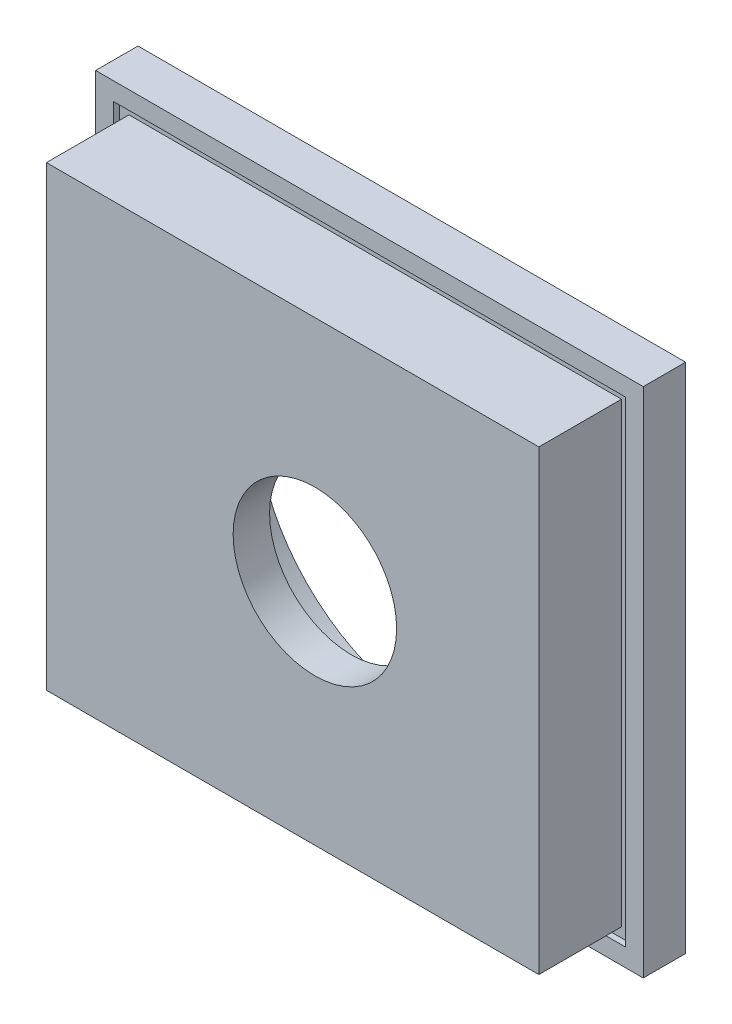
ISO-10303-21;
HEADER;
FILE_DESCRIPTION(('STEP AP214'),'2;1');
FILE_NAME('part.step','',(''),(''),'','','');
FILE_SCHEMA(('AUTOMOTIVE_DESIGN { 1 0 10303 214 1 1 1 1 }'));
ENDSEC;
DATA;
#1=APPLICATION_CONTEXT('core data for automotive mechanical design processes');
#2=APPLICATION_PROTOCOL_DEFINITION('international standard','automotive_design',2000,#1);
#3=PRODUCT_CONTEXT('',#1,'mechanical');
#4=PRODUCT('Part','Part','',(#3));
#5=PRODUCT_RELATED_PRODUCT_CATEGORY('part','',(#4));
#6=PRODUCT_DEFINITION_FORMATION('','',#4);
#7=PRODUCT_DEFINITION_CONTEXT('part definition',#1,'design');
#8=PRODUCT_DEFINITION('design','',#6,#7);
#9=PRODUCT_DEFINITION_SHAPE('','',#8);
#10=(LENGTH_UNIT() NAMED_UNIT(*) SI_UNIT(.MILLI.,.METRE.));
#11=(NAMED_UNIT(*) PLANE_ANGLE_UNIT() SI_UNIT($,.RADIAN.));
#12=(NAMED_UNIT(*) SI_UNIT($,.STERADIAN.) SOLID_ANGLE_UNIT());
#13=UNCERTAINTY_MEASURE_WITH_UNIT(LENGTH_MEASURE(1.E-05),#10,'distance_accuracy_value','');
#14=(GEOMETRIC_REPRESENTATION_CONTEXT(3) GLOBAL_UNCERTAINTY_ASSIGNED_CONTEXT((#13)) GLOBAL_UNIT_ASSIGNED_CONTEXT((#10,
#11,#12)) REPRESENTATION_CONTEXT('',''));
#15=CARTESIAN_POINT('',(0.,0.,0.));
#16=DIRECTION('',(0.,0.,1.));
#17=DIRECTION('',(1.,0.,0.));
#18=AXIS2_PLACEMENT_3D('',#15,#16,#17);
#19=CARTESIAN_POINT('',(150.3,130.,42.));
#20=DIRECTION('',(0.,0.,-1.));
#21=DIRECTION('',(-1.,0.,0.));
#22=AXIS2_PLACEMENT_3D('',#19,#20,#21);
#23=CYLINDRICAL_SURFACE('',#22,90.5);
#24=CARTESIAN_POINT('',(150.3,130.,0.));
#25=DIRECTION('',(0.,0.,1.));
#26=DIRECTION('',(1.,0.,0.));
#27=AXIS2_PLACEMENT_3D('',#24,#25,#26);
#28=CIRCLE('',#27,90.5);
#29=CARTESIAN_POINT('',(240.8,130.,0.));
#30=VERTEX_POINT('',#29);
#31=EDGE_CURVE('E275',#30,#30,#28,.T.);
#32=ORIENTED_EDGE('',*,*,#31,.F.);
#33=EDGE_LOOP('',(#32));
#34=FACE_BOUND('',#33,.T.);
#35=CARTESIAN_POINT('',(150.3,130.,42.));
#36=DIRECTION('',(0.,0.,1.));
#37=DIRECTION('',(1.,0.,0.));
#38=AXIS2_PLACEMENT_3D('',#35,#36,#37);
#39=CIRCLE('',#38,90.5);
#40=CARTESIAN_POINT('',(240.8,130.,42.));
#41=VERTEX_POINT('',#40);
#42=EDGE_CURVE('E271',#41,#41,#39,.T.);
#43=ORIENTED_EDGE('',*,*,#42,.T.);
#44=EDGE_LOOP('',(#43));
#45=FACE_BOUND('',#44,.T.);
#46=CARTESIAN_POINT('',(150.3,39.5,6.00000000000001));
#47=CARTESIAN_POINT('',(150.468461668725,39.5000006693389,6.00000745533471));
#48=CARTESIAN_POINT('',(150.63704430966,39.500475420697,6.01423729962665));
#49=CARTESIAN_POINT('',(150.969563332918,39.5023236582684,6.07080359932299));
#50=CARTESIAN_POINT('',(151.133493931284,39.503698216181,6.11317357142256));
#51=CARTESIAN_POINT('',(151.45184360416,39.5071904127946,6.22480957151065));
#52=CARTESIAN_POINT('',(151.606267312642,39.5093076860463,6.29406237371838));
#53=CARTESIAN_POINT('',(151.901254428058,39.5140465352439,6.45747905954885));
#54=CARTESIAN_POINT('',(152.04182119319,39.5166679885465,6.55163688702526));
#55=CARTESIAN_POINT('',(152.305221105626,39.5221215987173,6.76224808929431));
#56=CARTESIAN_POINT('',(152.428046288442,39.5249538493569,6.87871142316518));
#57=CARTESIAN_POINT('',(152.65240927785,39.5305090185251,7.13060969742526));
#58=CARTESIAN_POINT('',(152.753946233978,39.5332319326823,7.26604539539932));
#59=CARTESIAN_POINT('',(152.932865243994,39.5382618860058,7.55207638745825));
#60=CARTESIAN_POINT('',(153.010242173459,39.5405688369013,7.70267488867855));
#61=CARTESIAN_POINT('',(153.138611467042,39.544505788466,8.01473376018372));
#62=CARTESIAN_POINT('',(153.189603948693,39.5461357921509,8.17619408207942));
#63=CARTESIAN_POINT('',(153.263738797212,39.548534328688,8.50533001640761));
#64=CARTESIAN_POINT('',(153.286891473895,39.5493031804403,8.67300330428781));
#65=CARTESIAN_POINT('',(153.304721263274,39.5498936791272,9.00985822785477));
#66=CARTESIAN_POINT('',(153.299398503432,39.5497153303018,9.17903985678646));
#67=CARTESIAN_POINT('',(153.26043719998,39.5484318367469,9.51403906557217));
#68=CARTESIAN_POINT('',(153.226809797713,39.5473270566822,9.67985794278446));
#69=CARTESIAN_POINT('',(153.13221100757,39.5443158135154,10.0034956636558));
#70=CARTESIAN_POINT('',(153.071239552596,39.542409348446,10.1613144876831));
#71=CARTESIAN_POINT('',(152.92367063419,39.5380092236007,10.4645080649017));
#72=CARTESIAN_POINT('',(152.837068067339,39.5355154469051,10.6098803324154));
#73=CARTESIAN_POINT('',(152.640699033776,39.5302219378146,10.8840269513121));
#74=CARTESIAN_POINT('',(152.530932500387,39.5274222045389,11.0128012549155));
#75=CARTESIAN_POINT('',(152.291288400419,39.5218307656828,11.2501614086873));
#76=CARTESIAN_POINT('',(152.161401175114,39.519039064617,11.3587375075367));
#77=CARTESIAN_POINT('',(151.885236774167,39.5137796928698,11.5525440814761));
#78=CARTESIAN_POINT('',(151.738959595728,39.5113120222435,11.6377745525837));
#79=CARTESIAN_POINT('',(151.434162118433,39.5069788338669,11.7824694127845));
#80=CARTESIAN_POINT('',(151.275641671906,39.5051133233809,11.841933491041));
#81=CARTESIAN_POINT('',(150.950859939355,39.5021948558943,11.9334013484784));
#82=CARTESIAN_POINT('',(150.784598678986,39.501141896201,11.9654052186599));
#83=CARTESIAN_POINT('',(150.449139605765,39.4999675663169,12.001032226987));
#84=CARTESIAN_POINT('',(150.2799432273,39.4998457532538,12.0046688571849));
#85=CARTESIAN_POINT('',(149.943342384133,39.5005462740504,11.9834933207665));
#86=CARTESIAN_POINT('',(149.775937916878,39.5013686065642,11.9586811946998));
#87=CARTESIAN_POINT('',(149.447710550792,39.5038644623065,11.8813236392684));
#88=CARTESIAN_POINT('',(149.286886205605,39.5055377973808,11.8287843402005));
#89=CARTESIAN_POINT('',(148.976339885381,39.5095471193318,11.6974700602185));
#90=CARTESIAN_POINT('',(148.826617937851,39.5118831078503,11.618695014303));
#91=CARTESIAN_POINT('',(148.542464397464,39.5169557336091,11.4371106631431));
#92=CARTESIAN_POINT('',(148.408038607134,39.5196925219966,11.3342922820566));
#93=CARTESIAN_POINT('',(148.158351526558,39.5252578345468,11.1075532180054));
#94=CARTESIAN_POINT('',(148.043090294434,39.5280863589877,10.9836324710442));
#95=CARTESIAN_POINT('',(147.834959079449,39.5335175435777,10.7181484906926));
#96=CARTESIAN_POINT('',(147.742097805167,39.5361201156309,10.5765784280009));
#97=CARTESIAN_POINT('',(147.581462031146,39.540804575463,10.2798492708986));
#98=CARTESIAN_POINT('',(147.513687468302,39.5428864645515,10.124690210672));
#99=CARTESIAN_POINT('',(147.405164241662,39.5462941959245,9.80522017789087));
#100=CARTESIAN_POINT('',(147.3644099534,39.5476201955446,9.64091111769873));
#101=CARTESIAN_POINT('',(147.31106570951,39.5493670837606,9.30777817771377));
#102=CARTESIAN_POINT('',(147.298475712356,39.5497879736909,9.13895430457782));
#103=CARTESIAN_POINT('',(147.301818072997,39.5496771311941,8.80167108482766));
#104=CARTESIAN_POINT('',(147.317736704094,39.549145857227,8.63321160186203));
#105=CARTESIAN_POINT('',(147.377616193726,39.5471915412763,8.3013576877107));
#106=CARTESIAN_POINT('',(147.421577107632,39.5457684975319,8.13796326652712));
#107=CARTESIAN_POINT('',(147.536291156051,39.5421911362467,7.82087297961638));
#108=CARTESIAN_POINT('',(147.607044717949,39.5400368070407,7.66717726864473));
#109=CARTESIAN_POINT('',(147.773331556138,39.535239818264,7.37384855776983));
#110=CARTESIAN_POINT('',(147.868863953257,39.5325971760198,7.23421505917268));
#111=CARTESIAN_POINT('',(148.082039524629,39.5271201296457,6.97290983964526));
#112=CARTESIAN_POINT('',(148.199690970975,39.5242856540284,6.85124486908821));
#113=CARTESIAN_POINT('',(148.453783702316,39.5187444944926,6.62935939197558));
#114=CARTESIAN_POINT('',(148.590229628907,39.5160378423645,6.52914419844709));
#115=CARTESIAN_POINT('',(148.87809811239,39.5110563710085,6.35298232765119));
#116=CARTESIAN_POINT('',(149.029530884054,39.5087818494393,6.2770523540245));
#117=CARTESIAN_POINT('',(149.342886100432,39.5049261996033,6.15178313369161));
#118=CARTESIAN_POINT('',(149.504795792153,39.5033442458792,6.1024122156465));
#119=CARTESIAN_POINT('',(149.773105153564,39.5014742421491,6.04472973197653));
#120=CARTESIAN_POINT('',(149.877763714787,39.5009238039202,6.02797722653054));
#121=CARTESIAN_POINT('',(150.088265585228,39.5001864725459,6.0056100194304));
#122=CARTESIAN_POINT('',(150.194108894018,39.4999995792691,5.99999531374916));
#123=CARTESIAN_POINT('',(150.3,39.5,6.00000000000001));
#124=B_SPLINE_CURVE_WITH_KNOTS('',3,(#46,#47,#48,#49,#50,#51,#52,#53,#54,#55,#56,#57,#58,#59,
#60,#61,#62,#63,#64,#65,#66,#67,#68,#69,#70,#71,#72,#73,#74,#75,#76,#77,#78,#79,#80,#81,#82,#83,
#84,#85,#86,#87,#88,#89,#90,#91,#92,#93,#94,#95,#96,#97,#98,#99,#100,#101,#102,#103,#104,#105,
#106,#107,#108,#109,#110,#111,#112,#113,#114,#115,#116,#117,#118,#119,#120,#121,#122,#123),
.UNSPECIFIED.,.T.,.F.,(4,2,2,2,2,2,2,2,2,2,2,2,2,2,2,2,2,2,2,2,2,2,2,2,2,2,2,2,2,2,2,2,2,2,2,2,
2,2,4),(0.,0.504998486708911,1.01059954024219,1.51595216342126,2.02118201297409,
2.52663796827291,3.03211411267343,3.53769739753527,4.04327843018438,4.54867217511341,
5.05406365778116,5.55925629996511,6.0644501818013,6.56974472072814,7.07504071418544,
7.58058002565672,8.08611942336594,8.59166491955444,9.09720874040457,9.60251209937507,
10.1078147381083,10.6130057045029,11.1181979225612,11.6235811485378,12.1289659072038,
12.6345468321222,13.140126485252,13.6456008652554,14.1510745000037,14.656304818299,
15.1615361342244,15.6667755097343,16.1719969614228,16.6774077333081,17.1829435489884,
17.6888263336988,18.19410451473,18.5115349902596,18.8289653510165),.UNSPECIFIED.);
#125=CARTESIAN_POINT('',(150.3,39.5,6.00000000000001));
#126=VERTEX_POINT('',#125);
#127=EDGE_CURVE('E42',#126,#126,#124,.T.);
#128=ORIENTED_EDGE('',*,*,#127,.T.);
#129=EDGE_LOOP('',(#128));
#130=FACE_BOUND('',#129,.T.);
#131=ADVANCED_FACE('F38',(#34,#45,#130),#23,.F.);
#132=CARTESIAN_POINT('',(0.,0.,60.5));
#133=DIRECTION('',(1.,0.,0.));
#134=DIRECTION('',(0.,1.,0.));
#135=AXIS2_PLACEMENT_3D('',#132,#133,#134);
#136=PLANE('',#135);
#137=DIRECTION('',(0.,-1.,0.));
#138=VECTOR('',#137,1.);
#139=CARTESIAN_POINT('',(-1.11022302462516E-13,260.,21.5));
#140=LINE('',#139,#138);
#141=CARTESIAN_POINT('',(-1.11022302462516E-13,260.,21.5));
#142=VERTEX_POINT('',#141);
#143=CARTESIAN_POINT('',(-1.11022302462516E-13,0.,21.5));
#144=VERTEX_POINT('',#143);
#145=EDGE_CURVE('E242',#142,#144,#140,.T.);
#146=ORIENTED_EDGE('',*,*,#145,.F.);
#147=DIRECTION('',(0.,0.,-1.));
#148=VECTOR('',#147,1.);
#149=CARTESIAN_POINT('',(-1.11022302462516E-13,260.,60.5));
#150=LINE('',#149,#148);
#151=CARTESIAN_POINT('',(-1.11022302462516E-13,260.,0.));
#152=VERTEX_POINT('',#151);
#153=EDGE_CURVE('E289',#142,#152,#150,.T.);
#154=ORIENTED_EDGE('',*,*,#153,.T.);
#155=DIRECTION('',(0.,-1.,0.));
#156=VECTOR('',#155,1.);
#157=CARTESIAN_POINT('',(0.,0.,0.));
#158=LINE('',#157,#156);
#159=CARTESIAN_POINT('',(0.,0.,0.));
#160=VERTEX_POINT('',#159);
#161=EDGE_CURVE('E274',#152,#160,#158,.T.);
#162=ORIENTED_EDGE('',*,*,#161,.T.);
#163=DIRECTION('',(0.,0.,-1.));
#164=VECTOR('',#163,1.);
#165=CARTESIAN_POINT('',(0.,0.,60.5));
#166=LINE('',#165,#164);
#167=EDGE_CURVE('E295',#144,#160,#166,.T.);
#168=ORIENTED_EDGE('',*,*,#167,.F.);
#169=EDGE_LOOP('',(#146,#154,#162,#168));
#170=FACE_BOUND('',#169,.T.);
#171=ADVANCED_FACE('F40',(#170),#136,.F.);
#172=CARTESIAN_POINT('',(0.,0.,60.5));
#173=DIRECTION('',(0.,1.,0.));
#174=DIRECTION('',(0.,0.,1.));
#175=AXIS2_PLACEMENT_3D('',#172,#173,#174);
#176=PLANE('',#175);
#177=CARTESIAN_POINT('',(150.3,0.,9.));
#178=DIRECTION('',(0.,1.,0.));
#179=DIRECTION('',(0.,0.,1.));
#180=AXIS2_PLACEMENT_3D('',#177,#178,#179);
#181=CIRCLE('',#180,2.99999999999999);
#182=CARTESIAN_POINT('',(150.3,0.,12.));
#183=VERTEX_POINT('',#182);
#184=EDGE_CURVE('E372',#183,#183,#181,.T.);
#185=ORIENTED_EDGE('',*,*,#184,.T.);
#186=EDGE_LOOP('',(#185));
#187=FACE_BOUND('',#186,.T.);
#188=DIRECTION('',(1.,0.,0.));
#189=VECTOR('',#188,1.);
#190=CARTESIAN_POINT('',(-1.11022302462516E-13,0.,21.5));
#191=LINE('',#190,#189);
#192=CARTESIAN_POINT('',(278.,0.,21.5));
#193=VERTEX_POINT('',#192);
#194=EDGE_CURVE('E250',#144,#193,#191,.T.);
#195=ORIENTED_EDGE('',*,*,#194,.F.);
#196=ORIENTED_EDGE('',*,*,#167,.T.);
#197=DIRECTION('',(1.,0.,0.));
#198=VECTOR('',#197,1.);
#199=CARTESIAN_POINT('',(0.,0.,0.));
#200=LINE('',#199,#198);
#201=CARTESIAN_POINT('',(278.,0.,0.));
#202=VERTEX_POINT('',#201);
#203=EDGE_CURVE('E280',#160,#202,#200,.T.);
#204=ORIENTED_EDGE('',*,*,#203,.T.);
#205=DIRECTION('',(0.,0.,-1.));
#206=VECTOR('',#205,1.);
#207=CARTESIAN_POINT('',(278.,0.,60.5));
#208=LINE('',#207,#206);
#209=EDGE_CURVE('E293',#193,#202,#208,.T.);
#210=ORIENTED_EDGE('',*,*,#209,.F.);
#211=EDGE_LOOP('',(#195,#196,#204,#210));
#212=FACE_BOUND('',#211,.T.);
#213=ADVANCED_FACE('F340',(#187,#212),#176,.F.);
#214=CARTESIAN_POINT('',(278.,0.,60.5));
#215=DIRECTION('',(-1.,0.,0.));
#216=DIRECTION('',(0.,-1.,0.));
#217=AXIS2_PLACEMENT_3D('',#214,#215,#216);
#218=PLANE('',#217);
#219=DIRECTION('',(0.,1.,0.));
#220=VECTOR('',#219,1.);
#221=CARTESIAN_POINT('',(278.,260.,21.5));
#222=LINE('',#221,#220);
#223=CARTESIAN_POINT('',(278.,260.,21.5));
#224=VERTEX_POINT('',#223);
#225=EDGE_CURVE('E65',#193,#224,#222,.T.);
#226=ORIENTED_EDGE('',*,*,#225,.F.);
#227=ORIENTED_EDGE('',*,*,#209,.T.);
#228=DIRECTION('',(0.,1.,0.));
#229=VECTOR('',#228,1.);
#230=CARTESIAN_POINT('',(278.,0.,0.));
#231=LINE('',#230,#229);
#232=CARTESIAN_POINT('',(278.,260.,0.));
#233=VERTEX_POINT('',#232);
#234=EDGE_CURVE('E283',#202,#233,#231,.T.);
#235=ORIENTED_EDGE('',*,*,#234,.T.);
#236=DIRECTION('',(0.,0.,-1.));
#237=VECTOR('',#236,1.);
#238=CARTESIAN_POINT('',(278.,260.,60.5));
#239=LINE('',#238,#237);
#240=EDGE_CURVE('E291',#224,#233,#239,.T.);
#241=ORIENTED_EDGE('',*,*,#240,.F.);
#242=EDGE_LOOP('',(#226,#227,#235,#241));
#243=FACE_BOUND('',#242,.T.);
#244=ADVANCED_FACE('F361',(#243),#218,.F.);
#245=CARTESIAN_POINT('',(-1.11022302462516E-13,260.,60.5));
#246=DIRECTION('',(0.,-1.,0.));
#247=DIRECTION('',(0.,0.,-1.));
#248=AXIS2_PLACEMENT_3D('',#245,#246,#247);
#249=PLANE('',#248);
#250=DIRECTION('',(-1.,0.,0.));
#251=VECTOR('',#250,1.);
#252=CARTESIAN_POINT('',(-1.11022302462516E-13,260.,21.5));
#253=LINE('',#252,#251);
#254=EDGE_CURVE('E253',#224,#142,#253,.T.);
#255=ORIENTED_EDGE('',*,*,#254,.F.);
#256=ORIENTED_EDGE('',*,*,#240,.T.);
#257=DIRECTION('',(-1.,0.,0.));
#258=VECTOR('',#257,1.);
#259=CARTESIAN_POINT('',(-1.11022302462516E-13,260.,0.));
#260=LINE('',#259,#258);
#261=EDGE_CURVE('E286',#233,#152,#260,.T.);
#262=ORIENTED_EDGE('',*,*,#261,.T.);
#263=ORIENTED_EDGE('',*,*,#153,.F.);
#264=EDGE_LOOP('',(#255,#256,#262,#263));
#265=FACE_BOUND('',#264,.T.);
#266=ADVANCED_FACE('F353',(#265),#249,.F.);
#267=CARTESIAN_POINT('',(0.,0.,60.5));
#268=DIRECTION('',(0.,0.,-1.));
#269=DIRECTION('',(-1.,0.,0.));
#270=AXIS2_PLACEMENT_3D('',#267,#268,#269);
#271=PLANE('',#270);
#272=CARTESIAN_POINT('',(150.3,130.,60.5));
#273=DIRECTION('',(0.,0.,1.));
#274=DIRECTION('',(1.,0.,0.));
#275=AXIS2_PLACEMENT_3D('',#272,#273,#274);
#276=CIRCLE('',#275,41.5);
#277=CARTESIAN_POINT('',(191.8,130.,60.5));
#278=VERTEX_POINT('',#277);
#279=EDGE_CURVE('E265',#278,#278,#276,.T.);
#280=ORIENTED_EDGE('',*,*,#279,.F.);
#281=EDGE_LOOP('',(#280));
#282=FACE_BOUND('',#281,.T.);
#283=DIRECTION('',(0.,-1.,0.));
#284=VECTOR('',#283,1.);
#285=CARTESIAN_POINT('',(13.9999999999999,246.,60.5));
#286=LINE('',#285,#284);
#287=CARTESIAN_POINT('',(13.9999999999999,246.,60.5));
#288=VERTEX_POINT('',#287);
#289=CARTESIAN_POINT('',(13.9999999999999,14.,60.5));
#290=VERTEX_POINT('',#289);
#291=EDGE_CURVE('E220',#288,#290,#286,.T.);
#292=ORIENTED_EDGE('',*,*,#291,.T.);
#293=DIRECTION('',(1.,0.,0.));
#294=VECTOR('',#293,1.);
#295=CARTESIAN_POINT('',(13.9999999999999,14.,60.5));
#296=LINE('',#295,#294);
#297=CARTESIAN_POINT('',(264.,14.,60.5));
#298=VERTEX_POINT('',#297);
#299=EDGE_CURVE('E230',#290,#298,#296,.T.);
#300=ORIENTED_EDGE('',*,*,#299,.T.);
#301=DIRECTION('',(0.,1.,0.));
#302=VECTOR('',#301,1.);
#303=CARTESIAN_POINT('',(264.,246.,60.5));
#304=LINE('',#303,#302);
#305=CARTESIAN_POINT('',(264.,246.,60.5));
#306=VERTEX_POINT('',#305);
#307=EDGE_CURVE('E233',#298,#306,#304,.T.);
#308=ORIENTED_EDGE('',*,*,#307,.T.);
#309=DIRECTION('',(-1.,0.,0.));
#310=VECTOR('',#309,1.);
#311=CARTESIAN_POINT('',(13.9999999999999,246.,60.5));
#312=LINE('',#311,#310);
#313=EDGE_CURVE('E236',#306,#288,#312,.T.);
#314=ORIENTED_EDGE('',*,*,#313,.T.);
#315=EDGE_LOOP('',(#292,#300,#308,#314));
#316=FACE_BOUND('',#315,.T.);
#317=ADVANCED_FACE('F349',(#282,#316),#271,.F.);
#318=CARTESIAN_POINT('',(0.,0.,0.));
#319=DIRECTION('',(0.,0.,-1.));
#320=DIRECTION('',(-1.,0.,0.));
#321=AXIS2_PLACEMENT_3D('',#318,#319,#320);
#322=PLANE('',#321);
#323=ORIENTED_EDGE('',*,*,#31,.T.);
#324=EDGE_LOOP('',(#323));
#325=FACE_BOUND('',#324,.T.);
#326=CARTESIAN_POINT('',(150.3,130.,0.));
#327=DIRECTION('',(0.,0.,1.));
#328=DIRECTION('',(1.,0.,0.));
#329=AXIS2_PLACEMENT_3D('',#326,#327,#328);
#330=CIRCLE('',#329,95.05);
#331=CARTESIAN_POINT('',(245.35,130.,0.));
#332=VERTEX_POINT('',#331);
#333=EDGE_CURVE('E255',#332,#332,#330,.T.);
#334=ORIENTED_EDGE('',*,*,#333,.F.);
#335=EDGE_LOOP('',(#334));
#336=FACE_BOUND('',#335,.T.);
#337=ADVANCED_FACE('F352',(#325,#336),#322,.T.);
#338=CARTESIAN_POINT('',(204.05,223.097730906827,0.));
#339=DIRECTION('',(0.,0.,-1.));
#340=DIRECTION('',(-1.,0.,0.));
#341=AXIS2_PLACEMENT_3D('',#338,#339,#340);
#342=CIRCLE('',#341,4.);
#343=CARTESIAN_POINT('',(200.05,223.097730906827,0.));
#344=VERTEX_POINT('',#343);
#345=EDGE_CURVE('E158',#344,#344,#342,.T.);
#346=ORIENTED_EDGE('',*,*,#345,.F.);
#347=EDGE_LOOP('',(#346));
#348=FACE_BOUND('',#347,.T.);
#349=CARTESIAN_POINT('',(96.5499999999998,223.097730906827,0.));
#350=DIRECTION('',(0.,0.,-1.));
#351=DIRECTION('',(-1.,0.,0.));
#352=AXIS2_PLACEMENT_3D('',#349,#350,#351);
#353=CIRCLE('',#352,4.);
#354=CARTESIAN_POINT('',(92.5499999999998,223.097730906827,0.));
#355=VERTEX_POINT('',#354);
#356=EDGE_CURVE('E157',#355,#355,#353,.T.);
#357=ORIENTED_EDGE('',*,*,#356,.F.);
#358=EDGE_LOOP('',(#357));
#359=FACE_BOUND('',#358,.T.);
#360=CARTESIAN_POINT('',(42.7999999999999,130.,0.));
#361=DIRECTION('',(0.,0.,-1.));
#362=DIRECTION('',(-1.,0.,0.));
#363=AXIS2_PLACEMENT_3D('',#360,#361,#362);
#364=CIRCLE('',#363,4.);
#365=CARTESIAN_POINT('',(38.8,130.,0.));
#366=VERTEX_POINT('',#365);
#367=EDGE_CURVE('E169',#366,#366,#364,.T.);
#368=ORIENTED_EDGE('',*,*,#367,.F.);
#369=EDGE_LOOP('',(#368));
#370=FACE_BOUND('',#369,.T.);
#371=CARTESIAN_POINT('',(96.5500000000005,36.9022690931725,0.));
#372=DIRECTION('',(0.,0.,-1.));
#373=DIRECTION('',(-1.,0.,0.));
#374=AXIS2_PLACEMENT_3D('',#371,#372,#373);
#375=CIRCLE('',#374,4.);
#376=CARTESIAN_POINT('',(92.5500000000005,36.9022690931725,0.));
#377=VERTEX_POINT('',#376);
#378=EDGE_CURVE('E175',#377,#377,#375,.T.);
#379=ORIENTED_EDGE('',*,*,#378,.F.);
#380=EDGE_LOOP('',(#379));
#381=FACE_BOUND('',#380,.T.);
#382=CARTESIAN_POINT('',(204.049999999999,36.9022690931725,0.));
#383=DIRECTION('',(0.,0.,-1.));
#384=DIRECTION('',(-1.,0.,0.));
#385=AXIS2_PLACEMENT_3D('',#382,#383,#384);
#386=CIRCLE('',#385,4.);
#387=CARTESIAN_POINT('',(200.049999999999,36.9022690931725,0.));
#388=VERTEX_POINT('',#387);
#389=EDGE_CURVE('E181',#388,#388,#386,.T.);
#390=ORIENTED_EDGE('',*,*,#389,.F.);
#391=EDGE_LOOP('',(#390));
#392=FACE_BOUND('',#391,.T.);
#393=CARTESIAN_POINT('',(257.8,130.,0.));
#394=DIRECTION('',(0.,0.,-1.));
#395=DIRECTION('',(-1.,0.,0.));
#396=AXIS2_PLACEMENT_3D('',#393,#394,#395);
#397=CIRCLE('',#396,4.);
#398=CARTESIAN_POINT('',(253.8,130.,0.));
#399=VERTEX_POINT('',#398);
#400=EDGE_CURVE('E187',#399,#399,#397,.T.);
#401=ORIENTED_EDGE('',*,*,#400,.F.);
#402=EDGE_LOOP('',(#401));
#403=FACE_BOUND('',#402,.T.);
#404=CARTESIAN_POINT('',(150.3,130.,0.));
#405=DIRECTION('',(0.,0.,1.));
#406=DIRECTION('',(1.,0.,0.));
#407=AXIS2_PLACEMENT_3D('',#404,#405,#406);
#408=CIRCLE('',#407,99.95);
#409=CARTESIAN_POINT('',(250.25,130.,0.));
#410=VERTEX_POINT('',#409);
#411=EDGE_CURVE('E259',#410,#410,#408,.T.);
#412=ORIENTED_EDGE('',*,*,#411,.T.);
#413=EDGE_LOOP('',(#412));
#414=FACE_BOUND('',#413,.T.);
#415=ORIENTED_EDGE('',*,*,#161,.F.);
#416=ORIENTED_EDGE('',*,*,#261,.F.);
#417=ORIENTED_EDGE('',*,*,#234,.F.);
#418=ORIENTED_EDGE('',*,*,#203,.F.);
#419=EDGE_LOOP('',(#415,#416,#417,#418));
#420=FACE_BOUND('',#419,.T.);
#421=ADVANCED_FACE('F355',(#348,#359,#370,#381,#392,#403,#414,#420),#322,.T.);
#422=CARTESIAN_POINT('',(150.3,130.,42.));
#423=DIRECTION('',(0.,0.,1.));
#424=DIRECTION('',(1.,0.,0.));
#425=AXIS2_PLACEMENT_3D('',#422,#423,#424);
#426=PLANE('',#425);
#427=CARTESIAN_POINT('',(150.3,130.,42.));
#428=DIRECTION('',(0.,0.,1.));
#429=DIRECTION('',(1.,0.,0.));
#430=AXIS2_PLACEMENT_3D('',#427,#428,#429);
#431=CIRCLE('',#430,41.5);
#432=CARTESIAN_POINT('',(191.8,130.,42.));
#433=VERTEX_POINT('',#432);
#434=EDGE_CURVE('E270',#433,#433,#431,.F.);
#435=ORIENTED_EDGE('',*,*,#434,.F.);
#436=EDGE_LOOP('',(#435));
#437=FACE_BOUND('',#436,.T.);
#438=ORIENTED_EDGE('',*,*,#42,.F.);
#439=EDGE_LOOP('',(#438));
#440=FACE_BOUND('',#439,.T.);
#441=ADVANCED_FACE('F347',(#437,#440),#426,.F.);
#442=CARTESIAN_POINT('',(150.3,130.,60.5));
#443=DIRECTION('',(0.,0.,-1.));
#444=DIRECTION('',(-1.,0.,0.));
#445=AXIS2_PLACEMENT_3D('',#442,#443,#444);
#446=CYLINDRICAL_SURFACE('',#445,41.5);
#447=ORIENTED_EDGE('',*,*,#279,.T.);
#448=EDGE_LOOP('',(#447));
#449=FACE_BOUND('',#448,.T.);
#450=ORIENTED_EDGE('',*,*,#434,.T.);
#451=EDGE_LOOP('',(#450));
#452=FACE_BOUND('',#451,.T.);
#453=ADVANCED_FACE('F403',(#449,#452),#446,.F.);
#454=CARTESIAN_POINT('',(150.3,130.,2.95));
#455=DIRECTION('',(0.,0.,1.));
#456=DIRECTION('',(1.,0.,0.));
#457=AXIS2_PLACEMENT_3D('',#454,#455,#456);
#458=PLANE('',#457);
#459=CARTESIAN_POINT('',(150.3,130.,2.95));
#460=DIRECTION('',(0.,0.,1.));
#461=DIRECTION('',(1.,0.,0.));
#462=AXIS2_PLACEMENT_3D('',#459,#460,#461);
#463=CIRCLE('',#462,99.95);
#464=CARTESIAN_POINT('',(250.25,130.,2.95));
#465=VERTEX_POINT('',#464);
#466=EDGE_CURVE('E262',#465,#465,#463,.T.);
#467=ORIENTED_EDGE('',*,*,#466,.F.);
#468=EDGE_LOOP('',(#467));
#469=FACE_BOUND('',#468,.T.);
#470=CARTESIAN_POINT('',(150.3,130.,2.95));
#471=DIRECTION('',(0.,0.,1.));
#472=DIRECTION('',(1.,0.,0.));
#473=AXIS2_PLACEMENT_3D('',#470,#471,#472);
#474=CIRCLE('',#473,95.05);
#475=CARTESIAN_POINT('',(245.35,130.,2.95));
#476=VERTEX_POINT('',#475);
#477=EDGE_CURVE('E256',#476,#476,#474,.T.);
#478=ORIENTED_EDGE('',*,*,#477,.T.);
#479=EDGE_LOOP('',(#478));
#480=FACE_BOUND('',#479,.T.);
#481=ADVANCED_FACE('F400',(#469,#480),#458,.F.);
#482=CARTESIAN_POINT('',(150.3,130.,2.95));
#483=DIRECTION('',(0.,0.,-1.));
#484=DIRECTION('',(-1.,0.,0.));
#485=AXIS2_PLACEMENT_3D('',#482,#483,#484);
#486=CYLINDRICAL_SURFACE('',#485,99.95);
#487=ORIENTED_EDGE('',*,*,#466,.T.);
#488=EDGE_LOOP('',(#487));
#489=FACE_BOUND('',#488,.T.);
#490=ORIENTED_EDGE('',*,*,#411,.F.);
#491=EDGE_LOOP('',(#490));
#492=FACE_BOUND('',#491,.T.);
#493=ADVANCED_FACE('F395',(#489,#492),#486,.F.);
#494=CARTESIAN_POINT('',(150.3,130.,2.95));
#495=DIRECTION('',(0.,0.,-1.));
#496=DIRECTION('',(-1.,0.,0.));
#497=AXIS2_PLACEMENT_3D('',#494,#495,#496);
#498=CYLINDRICAL_SURFACE('',#497,95.05);
#499=ORIENTED_EDGE('',*,*,#477,.F.);
#500=EDGE_LOOP('',(#499));
#501=FACE_BOUND('',#500,.T.);
#502=ORIENTED_EDGE('',*,*,#333,.T.);
#503=EDGE_LOOP('',(#502));
#504=FACE_BOUND('',#503,.T.);
#505=ADVANCED_FACE('F386',(#501,#504),#498,.T.);
#506=CARTESIAN_POINT('',(0.,0.,21.5));
#507=DIRECTION('',(0.,0.,1.));
#508=DIRECTION('',(1.,0.,0.));
#509=AXIS2_PLACEMENT_3D('',#506,#507,#508);
#510=PLANE('',#509);
#511=DIRECTION('',(0.,-1.,0.));
#512=VECTOR('',#511,1.);
#513=CARTESIAN_POINT('',(9.09999999999993,0.,21.5));
#514=LINE('',#513,#512);
#515=CARTESIAN_POINT('',(9.0999999999999,250.9,21.5));
#516=VERTEX_POINT('',#515);
#517=CARTESIAN_POINT('',(9.09999999999993,9.10000000000001,21.5));
#518=VERTEX_POINT('',#517);
#519=EDGE_CURVE('E11',#516,#518,#514,.T.);
#520=ORIENTED_EDGE('',*,*,#519,.F.);
#521=DIRECTION('',(-1.,0.,0.));
#522=VECTOR('',#521,1.);
#523=CARTESIAN_POINT('',(0.,250.9,21.5));
#524=LINE('',#523,#522);
#525=CARTESIAN_POINT('',(268.9,250.9,21.5));
#526=VERTEX_POINT('',#525);
#527=EDGE_CURVE('E51',#526,#516,#524,.T.);
#528=ORIENTED_EDGE('',*,*,#527,.F.);
#529=DIRECTION('',(0.,1.,0.));
#530=VECTOR('',#529,1.);
#531=CARTESIAN_POINT('',(268.9,0.,21.5));
#532=LINE('',#531,#530);
#533=CARTESIAN_POINT('',(268.9,9.10000000000001,21.5));
#534=VERTEX_POINT('',#533);
#535=EDGE_CURVE('E301',#534,#526,#532,.T.);
#536=ORIENTED_EDGE('',*,*,#535,.F.);
#537=DIRECTION('',(1.,0.,0.));
#538=VECTOR('',#537,1.);
#539=CARTESIAN_POINT('',(0.,9.10000000000001,21.5));
#540=LINE('',#539,#538);
#541=EDGE_CURVE('E297',#518,#534,#540,.T.);
#542=ORIENTED_EDGE('',*,*,#541,.F.);
#543=EDGE_LOOP('',(#520,#528,#536,#542));
#544=FACE_BOUND('',#543,.T.);
#545=ORIENTED_EDGE('',*,*,#145,.T.);
#546=ORIENTED_EDGE('',*,*,#194,.T.);
#547=ORIENTED_EDGE('',*,*,#225,.T.);
#548=ORIENTED_EDGE('',*,*,#254,.T.);
#549=EDGE_LOOP('',(#545,#546,#547,#548));
#550=FACE_BOUND('',#549,.T.);
#551=ADVANCED_FACE('F314',(#544,#550),#510,.T.);
#552=CARTESIAN_POINT('',(13.9999999999999,246.,21.5));
#553=DIRECTION('',(-1.,0.,0.));
#554=DIRECTION('',(0.,0.,1.));
#555=AXIS2_PLACEMENT_3D('',#552,#553,#554);
#556=PLANE('',#555);
#557=ORIENTED_EDGE('',*,*,#291,.F.);
#558=DIRECTION('',(0.,0.,1.));
#559=VECTOR('',#558,1.);
#560=CARTESIAN_POINT('',(13.9999999999999,246.,21.5));
#561=LINE('',#560,#559);
#562=CARTESIAN_POINT('',(13.9999999999999,246.,18.55));
#563=VERTEX_POINT('',#562);
#564=EDGE_CURVE('E240',#563,#288,#561,.T.);
#565=ORIENTED_EDGE('',*,*,#564,.F.);
#566=DIRECTION('',(0.,-1.,0.));
#567=VECTOR('',#566,1.);
#568=CARTESIAN_POINT('',(13.9999999999999,14.,18.55));
#569=LINE('',#568,#567);
#570=CARTESIAN_POINT('',(13.9999999999999,14.,18.55));
#571=VERTEX_POINT('',#570);
#572=EDGE_CURVE('E193',#563,#571,#569,.T.);
#573=ORIENTED_EDGE('',*,*,#572,.T.);
#574=DIRECTION('',(0.,0.,1.));
#575=VECTOR('',#574,1.);
#576=CARTESIAN_POINT('',(13.9999999999999,14.,21.5));
#577=LINE('',#576,#575);
#578=EDGE_CURVE('E239',#571,#290,#577,.T.);
#579=ORIENTED_EDGE('',*,*,#578,.T.);
#580=EDGE_LOOP('',(#557,#565,#573,#579));
#581=FACE_BOUND('',#580,.T.);
#582=ADVANCED_FACE('F385',(#581),#556,.T.);
#583=CARTESIAN_POINT('',(13.9999999999999,246.,21.5));
#584=DIRECTION('',(0.,1.,0.));
#585=DIRECTION('',(0.,0.,1.));
#586=AXIS2_PLACEMENT_3D('',#583,#584,#585);
#587=PLANE('',#586);
#588=ORIENTED_EDGE('',*,*,#313,.F.);
#589=DIRECTION('',(0.,0.,1.));
#590=VECTOR('',#589,1.);
#591=CARTESIAN_POINT('',(264.,246.,21.5));
#592=LINE('',#591,#590);
#593=CARTESIAN_POINT('',(264.,246.,18.55));
#594=VERTEX_POINT('',#593);
#595=EDGE_CURVE('E243',#594,#306,#592,.T.);
#596=ORIENTED_EDGE('',*,*,#595,.F.);
#597=DIRECTION('',(-1.,0.,0.));
#598=VECTOR('',#597,1.);
#599=CARTESIAN_POINT('',(13.9999999999999,246.,18.55));
#600=LINE('',#599,#598);
#601=EDGE_CURVE('E202',#594,#563,#600,.T.);
#602=ORIENTED_EDGE('',*,*,#601,.T.);
#603=ORIENTED_EDGE('',*,*,#564,.T.);
#604=EDGE_LOOP('',(#588,#596,#602,#603));
#605=FACE_BOUND('',#604,.T.);
#606=ADVANCED_FACE('F392',(#605),#587,.T.);
#607=CARTESIAN_POINT('',(264.,246.,21.5));
#608=DIRECTION('',(1.,0.,0.));
#609=DIRECTION('',(0.,0.,-1.));
#610=AXIS2_PLACEMENT_3D('',#607,#608,#609);
#611=PLANE('',#610);
#612=ORIENTED_EDGE('',*,*,#307,.F.);
#613=DIRECTION('',(0.,0.,1.));
#614=VECTOR('',#613,1.);
#615=CARTESIAN_POINT('',(264.,14.,21.5));
#616=LINE('',#615,#614);
#617=CARTESIAN_POINT('',(264.,14.,18.55));
#618=VERTEX_POINT('',#617);
#619=EDGE_CURVE('E245',#618,#298,#616,.T.);
#620=ORIENTED_EDGE('',*,*,#619,.F.);
#621=DIRECTION('',(0.,1.,0.));
#622=VECTOR('',#621,1.);
#623=CARTESIAN_POINT('',(264.,14.,18.55));
#624=LINE('',#623,#622);
#625=EDGE_CURVE('E199',#618,#594,#624,.T.);
#626=ORIENTED_EDGE('',*,*,#625,.T.);
#627=ORIENTED_EDGE('',*,*,#595,.T.);
#628=EDGE_LOOP('',(#612,#620,#626,#627));
#629=FACE_BOUND('',#628,.T.);
#630=ADVANCED_FACE('F562',(#629),#611,.T.);
#631=CARTESIAN_POINT('',(13.9999999999999,14.,21.5));
#632=DIRECTION('',(0.,-1.,0.));
#633=DIRECTION('',(0.,0.,-1.));
#634=AXIS2_PLACEMENT_3D('',#631,#632,#633);
#635=PLANE('',#634);
#636=ORIENTED_EDGE('',*,*,#299,.F.);
#637=ORIENTED_EDGE('',*,*,#578,.F.);
#638=DIRECTION('',(1.,0.,0.));
#639=VECTOR('',#638,1.);
#640=CARTESIAN_POINT('',(13.9999999999999,14.,18.55));
#641=LINE('',#640,#639);
#642=EDGE_CURVE('E196',#571,#618,#641,.T.);
#643=ORIENTED_EDGE('',*,*,#642,.T.);
#644=ORIENTED_EDGE('',*,*,#619,.T.);
#645=EDGE_LOOP('',(#636,#637,#643,#644));
#646=FACE_BOUND('',#645,.T.);
#647=ADVANCED_FACE('F572',(#646),#635,.T.);
#648=CARTESIAN_POINT('',(9.0999999999999,250.9,18.55));
#649=DIRECTION('',(-1.,0.,0.));
#650=DIRECTION('',(0.,-1.,0.));
#651=AXIS2_PLACEMENT_3D('',#648,#649,#650);
#652=PLANE('',#651);
#653=ORIENTED_EDGE('',*,*,#519,.T.);
#654=DIRECTION('',(0.,0.,1.));
#655=VECTOR('',#654,1.);
#656=CARTESIAN_POINT('',(9.09999999999993,9.10000000000001,18.55));
#657=LINE('',#656,#655);
#658=CARTESIAN_POINT('',(9.09999999999993,9.10000000000001,18.55));
#659=VERTEX_POINT('',#658);
#660=EDGE_CURVE('E58',#659,#518,#657,.T.);
#661=ORIENTED_EDGE('',*,*,#660,.F.);
#662=DIRECTION('',(0.,-1.,0.));
#663=VECTOR('',#662,1.);
#664=CARTESIAN_POINT('',(9.0999999999999,250.9,18.55));
#665=LINE('',#664,#663);
#666=CARTESIAN_POINT('',(9.0999999999999,250.9,18.55));
#667=VERTEX_POINT('',#666);
#668=EDGE_CURVE('E205',#667,#659,#665,.T.);
#669=ORIENTED_EDGE('',*,*,#668,.F.);
#670=DIRECTION('',(0.,0.,1.));
#671=VECTOR('',#670,1.);
#672=CARTESIAN_POINT('',(9.0999999999999,250.9,18.55));
#673=LINE('',#672,#671);
#674=EDGE_CURVE('E217',#667,#516,#673,.T.);
#675=ORIENTED_EDGE('',*,*,#674,.T.);
#676=EDGE_LOOP('',(#653,#661,#669,#675));
#677=FACE_BOUND('',#676,.T.);
#678=ADVANCED_FACE('F312',(#677),#652,.F.);
#679=CARTESIAN_POINT('',(9.0999999999999,250.9,18.55));
#680=DIRECTION('',(0.,1.,0.));
#681=DIRECTION('',(0.,0.,1.));
#682=AXIS2_PLACEMENT_3D('',#679,#680,#681);
#683=PLANE('',#682);
#684=ORIENTED_EDGE('',*,*,#527,.T.);
#685=ORIENTED_EDGE('',*,*,#674,.F.);
#686=DIRECTION('',(-1.,0.,0.));
#687=VECTOR('',#686,1.);
#688=CARTESIAN_POINT('',(9.0999999999999,250.9,18.55));
#689=LINE('',#688,#687);
#690=CARTESIAN_POINT('',(268.9,250.9,18.55));
#691=VERTEX_POINT('',#690);
#692=EDGE_CURVE('E214',#691,#667,#689,.T.);
#693=ORIENTED_EDGE('',*,*,#692,.F.);
#694=DIRECTION('',(0.,0.,1.));
#695=VECTOR('',#694,1.);
#696=CARTESIAN_POINT('',(268.9,250.9,18.55));
#697=LINE('',#696,#695);
#698=EDGE_CURVE('E221',#691,#526,#697,.T.);
#699=ORIENTED_EDGE('',*,*,#698,.T.);
#700=EDGE_LOOP('',(#684,#685,#693,#699));
#701=FACE_BOUND('',#700,.T.);
#702=ADVANCED_FACE('F305',(#701),#683,.F.);
#703=CARTESIAN_POINT('',(268.9,250.9,18.55));
#704=DIRECTION('',(1.,0.,0.));
#705=DIRECTION('',(0.,1.,0.));
#706=AXIS2_PLACEMENT_3D('',#703,#704,#705);
#707=PLANE('',#706);
#708=ORIENTED_EDGE('',*,*,#535,.T.);
#709=ORIENTED_EDGE('',*,*,#698,.F.);
#710=DIRECTION('',(0.,1.,0.));
#711=VECTOR('',#710,1.);
#712=CARTESIAN_POINT('',(268.9,250.9,18.55));
#713=LINE('',#712,#711);
#714=CARTESIAN_POINT('',(268.9,9.10000000000001,18.55));
#715=VERTEX_POINT('',#714);
#716=EDGE_CURVE('E211',#715,#691,#713,.T.);
#717=ORIENTED_EDGE('',*,*,#716,.F.);
#718=DIRECTION('',(0.,0.,1.));
#719=VECTOR('',#718,1.);
#720=CARTESIAN_POINT('',(268.9,9.10000000000001,18.55));
#721=LINE('',#720,#719);
#722=EDGE_CURVE('E224',#715,#534,#721,.T.);
#723=ORIENTED_EDGE('',*,*,#722,.T.);
#724=EDGE_LOOP('',(#708,#709,#717,#723));
#725=FACE_BOUND('',#724,.T.);
#726=ADVANCED_FACE('F318',(#725),#707,.F.);
#727=CARTESIAN_POINT('',(9.09999999999993,9.10000000000001,18.55));
#728=DIRECTION('',(0.,-1.,0.));
#729=DIRECTION('',(0.,0.,-1.));
#730=AXIS2_PLACEMENT_3D('',#727,#728,#729);
#731=PLANE('',#730);
#732=ORIENTED_EDGE('',*,*,#541,.T.);
#733=ORIENTED_EDGE('',*,*,#722,.F.);
#734=DIRECTION('',(1.,0.,0.));
#735=VECTOR('',#734,1.);
#736=CARTESIAN_POINT('',(9.09999999999993,9.10000000000001,18.55));
#737=LINE('',#736,#735);
#738=EDGE_CURVE('E208',#659,#715,#737,.T.);
#739=ORIENTED_EDGE('',*,*,#738,.F.);
#740=ORIENTED_EDGE('',*,*,#660,.T.);
#741=EDGE_LOOP('',(#732,#733,#739,#740));
#742=FACE_BOUND('',#741,.T.);
#743=ADVANCED_FACE('F315',(#742),#731,.F.);
#744=CARTESIAN_POINT('',(0.,0.,18.55));
#745=DIRECTION('',(0.,0.,1.));
#746=DIRECTION('',(1.,0.,0.));
#747=AXIS2_PLACEMENT_3D('',#744,#745,#746);
#748=PLANE('',#747);
#749=ORIENTED_EDGE('',*,*,#601,.F.);
#750=ORIENTED_EDGE('',*,*,#625,.F.);
#751=ORIENTED_EDGE('',*,*,#642,.F.);
#752=ORIENTED_EDGE('',*,*,#572,.F.);
#753=EDGE_LOOP('',(#749,#750,#751,#752));
#754=FACE_BOUND('',#753,.T.);
#755=ORIENTED_EDGE('',*,*,#668,.T.);
#756=ORIENTED_EDGE('',*,*,#738,.T.);
#757=ORIENTED_EDGE('',*,*,#716,.T.);
#758=ORIENTED_EDGE('',*,*,#692,.T.);
#759=EDGE_LOOP('',(#755,#756,#757,#758));
#760=FACE_BOUND('',#759,.T.);
#761=ADVANCED_FACE('F320',(#754,#760),#748,.T.);
#762=CARTESIAN_POINT('',(257.8,130.,15.));
#763=DIRECTION('',(0.,0.,-1.));
#764=DIRECTION('',(-1.,0.,0.));
#765=AXIS2_PLACEMENT_3D('',#762,#763,#764);
#766=CONICAL_SURFACE('',#765,4.,1.02974425867666);
#767=CARTESIAN_POINT('',(257.8,130.,17.4034424761102));
#768=VERTEX_POINT('',#767);
#769=VERTEX_LOOP('',#768);
#770=FACE_BOUND('',#769,.T.);
#771=CARTESIAN_POINT('',(257.8,130.,15.));
#772=DIRECTION('',(0.,0.,-1.));
#773=DIRECTION('',(-1.,0.,0.));
#774=AXIS2_PLACEMENT_3D('',#771,#772,#773);
#775=CIRCLE('',#774,4.);
#776=CARTESIAN_POINT('',(253.8,130.,15.));
#777=VERTEX_POINT('',#776);
#778=EDGE_CURVE('E190',#777,#777,#775,.T.);
#779=ORIENTED_EDGE('',*,*,#778,.T.);
#780=EDGE_LOOP('',(#779));
#781=FACE_BOUND('',#780,.T.);
#782=ADVANCED_FACE('F322',(#770,#781),#766,.F.);
#783=CARTESIAN_POINT('',(257.8,130.,0.));
#784=DIRECTION('',(0.,0.,-1.));
#785=DIRECTION('',(-1.,0.,0.));
#786=AXIS2_PLACEMENT_3D('',#783,#784,#785);
#787=CYLINDRICAL_SURFACE('',#786,4.);
#788=ORIENTED_EDGE('',*,*,#778,.F.);
#789=EDGE_LOOP('',(#788));
#790=FACE_BOUND('',#789,.T.);
#791=ORIENTED_EDGE('',*,*,#400,.T.);
#792=EDGE_LOOP('',(#791));
#793=FACE_BOUND('',#792,.T.);
#794=ADVANCED_FACE('F329',(#790,#793),#787,.F.);
#795=CARTESIAN_POINT('',(204.049999999999,36.9022690931725,15.));
#796=DIRECTION('',(0.,0.,-1.));
#797=DIRECTION('',(-1.,0.,0.));
#798=AXIS2_PLACEMENT_3D('',#795,#796,#797);
#799=CONICAL_SURFACE('',#798,4.,1.02974425867666);
#800=CARTESIAN_POINT('',(204.049999999999,36.9022690931725,17.4034424761102));
#801=VERTEX_POINT('',#800);
#802=VERTEX_LOOP('',#801);
#803=FACE_BOUND('',#802,.T.);
#804=CARTESIAN_POINT('',(204.049999999999,36.9022690931725,15.));
#805=DIRECTION('',(0.,0.,-1.));
#806=DIRECTION('',(-1.,0.,0.));
#807=AXIS2_PLACEMENT_3D('',#804,#805,#806);
#808=CIRCLE('',#807,4.);
#809=CARTESIAN_POINT('',(200.049999999999,36.9022690931725,15.));
#810=VERTEX_POINT('',#809);
#811=EDGE_CURVE('E184',#810,#810,#808,.T.);
#812=ORIENTED_EDGE('',*,*,#811,.T.);
#813=EDGE_LOOP('',(#812));
#814=FACE_BOUND('',#813,.T.);
#815=ADVANCED_FACE('F457',(#803,#814),#799,.F.);
#816=CARTESIAN_POINT('',(204.049999999999,36.9022690931725,0.));
#817=DIRECTION('',(0.,0.,-1.));
#818=DIRECTION('',(-1.,0.,0.));
#819=AXIS2_PLACEMENT_3D('',#816,#817,#818);
#820=CYLINDRICAL_SURFACE('',#819,4.);
#821=ORIENTED_EDGE('',*,*,#811,.F.);
#822=EDGE_LOOP('',(#821));
#823=FACE_BOUND('',#822,.T.);
#824=ORIENTED_EDGE('',*,*,#389,.T.);
#825=EDGE_LOOP('',(#824));
#826=FACE_BOUND('',#825,.T.);
#827=ADVANCED_FACE('F453',(#823,#826),#820,.F.);
#828=CARTESIAN_POINT('',(96.5500000000005,36.9022690931725,15.));
#829=DIRECTION('',(0.,0.,-1.));
#830=DIRECTION('',(-1.,0.,0.));
#831=AXIS2_PLACEMENT_3D('',#828,#829,#830);
#832=CONICAL_SURFACE('',#831,4.,1.02974425867666);
#833=CARTESIAN_POINT('',(96.5500000000005,36.9022690931725,17.4034424761102));
#834=VERTEX_POINT('',#833);
#835=VERTEX_LOOP('',#834);
#836=FACE_BOUND('',#835,.T.);
#837=CARTESIAN_POINT('',(96.5500000000005,36.9022690931725,15.));
#838=DIRECTION('',(0.,0.,-1.));
#839=DIRECTION('',(-1.,0.,0.));
#840=AXIS2_PLACEMENT_3D('',#837,#838,#839);
#841=CIRCLE('',#840,4.);
#842=CARTESIAN_POINT('',(92.5500000000005,36.9022690931725,15.));
#843=VERTEX_POINT('',#842);
#844=EDGE_CURVE('E178',#843,#843,#841,.T.);
#845=ORIENTED_EDGE('',*,*,#844,.T.);
#846=EDGE_LOOP('',(#845));
#847=FACE_BOUND('',#846,.T.);
#848=ADVANCED_FACE('F449',(#836,#847),#832,.F.);
#849=CARTESIAN_POINT('',(96.5500000000005,36.9022690931725,0.));
#850=DIRECTION('',(0.,0.,-1.));
#851=DIRECTION('',(-1.,0.,0.));
#852=AXIS2_PLACEMENT_3D('',#849,#850,#851);
#853=CYLINDRICAL_SURFACE('',#852,4.);
#854=ORIENTED_EDGE('',*,*,#844,.F.);
#855=EDGE_LOOP('',(#854));
#856=FACE_BOUND('',#855,.T.);
#857=ORIENTED_EDGE('',*,*,#378,.T.);
#858=EDGE_LOOP('',(#857));
#859=FACE_BOUND('',#858,.T.);
#860=ADVANCED_FACE('F445',(#856,#859),#853,.F.);
#861=CARTESIAN_POINT('',(42.7999999999999,130.,15.));
#862=DIRECTION('',(0.,0.,-1.));
#863=DIRECTION('',(-1.,0.,0.));
#864=AXIS2_PLACEMENT_3D('',#861,#862,#863);
#865=CONICAL_SURFACE('',#864,4.,1.02974425867665);
#866=CARTESIAN_POINT('',(42.7999999999999,130.,17.4034424761102));
#867=VERTEX_POINT('',#866);
#868=VERTEX_LOOP('',#867);
#869=FACE_BOUND('',#868,.T.);
#870=CARTESIAN_POINT('',(42.7999999999999,130.,15.));
#871=DIRECTION('',(0.,0.,-1.));
#872=DIRECTION('',(-1.,0.,0.));
#873=AXIS2_PLACEMENT_3D('',#870,#871,#872);
#874=CIRCLE('',#873,4.);
#875=CARTESIAN_POINT('',(38.8,130.,15.));
#876=VERTEX_POINT('',#875);
#877=EDGE_CURVE('E172',#876,#876,#874,.T.);
#878=ORIENTED_EDGE('',*,*,#877,.T.);
#879=EDGE_LOOP('',(#878));
#880=FACE_BOUND('',#879,.T.);
#881=ADVANCED_FACE('F441',(#869,#880),#865,.F.);
#882=CARTESIAN_POINT('',(42.7999999999999,130.,0.));
#883=DIRECTION('',(0.,0.,-1.));
#884=DIRECTION('',(-1.,0.,0.));
#885=AXIS2_PLACEMENT_3D('',#882,#883,#884);
#886=CYLINDRICAL_SURFACE('',#885,4.);
#887=ORIENTED_EDGE('',*,*,#877,.F.);
#888=EDGE_LOOP('',(#887));
#889=FACE_BOUND('',#888,.T.);
#890=ORIENTED_EDGE('',*,*,#367,.T.);
#891=EDGE_LOOP('',(#890));
#892=FACE_BOUND('',#891,.T.);
#893=ADVANCED_FACE('F437',(#889,#892),#886,.F.);
#894=CARTESIAN_POINT('',(96.5499999999998,223.097730906827,15.));
#895=DIRECTION('',(0.,0.,-1.));
#896=DIRECTION('',(-1.,0.,0.));
#897=AXIS2_PLACEMENT_3D('',#894,#895,#896);
#898=CONICAL_SURFACE('',#897,4.,1.02974425867666);
#899=CARTESIAN_POINT('',(96.5499999999998,223.097730906827,17.4034424761102));
#900=VERTEX_POINT('',#899);
#901=VERTEX_LOOP('',#900);
#902=FACE_BOUND('',#901,.T.);
#903=CARTESIAN_POINT('',(96.5499999999998,223.097730906827,15.));
#904=DIRECTION('',(0.,0.,-1.));
#905=DIRECTION('',(-1.,0.,0.));
#906=AXIS2_PLACEMENT_3D('',#903,#904,#905);
#907=CIRCLE('',#906,4.);
#908=CARTESIAN_POINT('',(92.5499999999998,223.097730906827,15.));
#909=VERTEX_POINT('',#908);
#910=EDGE_CURVE('E161',#909,#909,#907,.T.);
#911=ORIENTED_EDGE('',*,*,#910,.T.);
#912=EDGE_LOOP('',(#911));
#913=FACE_BOUND('',#912,.T.);
#914=ADVANCED_FACE('F433',(#902,#913),#898,.F.);
#915=CARTESIAN_POINT('',(96.5499999999998,223.097730906827,0.));
#916=DIRECTION('',(0.,0.,-1.));
#917=DIRECTION('',(-1.,0.,0.));
#918=AXIS2_PLACEMENT_3D('',#915,#916,#917);
#919=CYLINDRICAL_SURFACE('',#918,4.);
#920=ORIENTED_EDGE('',*,*,#910,.F.);
#921=EDGE_LOOP('',(#920));
#922=FACE_BOUND('',#921,.T.);
#923=ORIENTED_EDGE('',*,*,#356,.T.);
#924=EDGE_LOOP('',(#923));
#925=FACE_BOUND('',#924,.T.);
#926=ADVANCED_FACE('F151',(#922,#925),#919,.F.);
#927=CARTESIAN_POINT('',(204.05,223.097730906827,15.));
#928=DIRECTION('',(0.,0.,-1.));
#929=DIRECTION('',(-1.,0.,0.));
#930=AXIS2_PLACEMENT_3D('',#927,#928,#929);
#931=CONICAL_SURFACE('',#930,4.,1.02974425867666);
#932=CARTESIAN_POINT('',(204.05,223.097730906827,17.4034424761102));
#933=VERTEX_POINT('',#932);
#934=VERTEX_LOOP('',#933);
#935=FACE_BOUND('',#934,.T.);
#936=CARTESIAN_POINT('',(204.05,223.097730906827,15.));
#937=DIRECTION('',(0.,0.,-1.));
#938=DIRECTION('',(-1.,0.,0.));
#939=AXIS2_PLACEMENT_3D('',#936,#937,#938);
#940=CIRCLE('',#939,4.);
#941=CARTESIAN_POINT('',(200.05,223.097730906827,15.));
#942=VERTEX_POINT('',#941);
#943=EDGE_CURVE('E155',#942,#942,#940,.T.);
#944=ORIENTED_EDGE('',*,*,#943,.T.);
#945=EDGE_LOOP('',(#944));
#946=FACE_BOUND('',#945,.T.);
#947=ADVANCED_FACE('F147',(#935,#946),#931,.F.);
#948=CARTESIAN_POINT('',(204.05,223.097730906827,0.));
#949=DIRECTION('',(0.,0.,-1.));
#950=DIRECTION('',(-1.,0.,0.));
#951=AXIS2_PLACEMENT_3D('',#948,#949,#950);
#952=CYLINDRICAL_SURFACE('',#951,4.);
#953=ORIENTED_EDGE('',*,*,#943,.F.);
#954=EDGE_LOOP('',(#953));
#955=FACE_BOUND('',#954,.T.);
#956=ORIENTED_EDGE('',*,*,#345,.T.);
#957=EDGE_LOOP('',(#956));
#958=FACE_BOUND('',#957,.T.);
#959=ADVANCED_FACE('F150',(#955,#958),#952,.F.);
#960=CARTESIAN_POINT('',(150.3,46.,9.));
#961=DIRECTION('',(0.,-1.,0.));
#962=DIRECTION('',(0.,0.,-1.));
#963=AXIS2_PLACEMENT_3D('',#960,#961,#962);
#964=CYLINDRICAL_SURFACE('',#963,2.99999999999999);
#965=ORIENTED_EDGE('',*,*,#127,.F.);
#966=EDGE_LOOP('',(#965));
#967=FACE_BOUND('',#966,.T.);
#968=ORIENTED_EDGE('',*,*,#184,.F.);
#969=EDGE_LOOP('',(#968));
#970=FACE_BOUND('',#969,.T.);
#971=ADVANCED_FACE('F422',(#967,#970),#964,.F.);
#972=CLOSED_SHELL('',(#131,#171,#213,#244,#266,#317,#337,#421,#441,#453,#481,#493,#505,#551,
#582,#606,#630,#647,#678,#702,#726,#743,#761,#782,#794,#815,#827,#848,#860,#881,#893,#914,#926,
#947,#959,#971));
#973=MANIFOLD_SOLID_BREP('B2',#972);
#974=ADVANCED_BREP_SHAPE_REPRESENTATION('',(#18,#973),#14);
#975=SHAPE_DEFINITION_REPRESENTATION(#9,#974);
ENDSEC;
END-ISO-10303-21;
